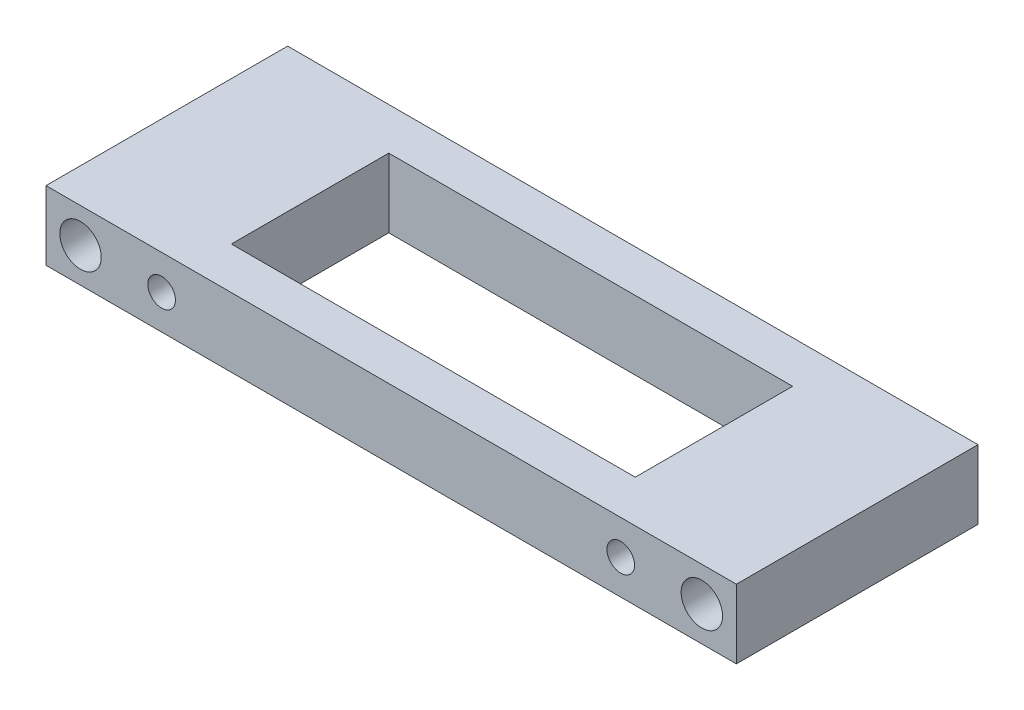
ISO-10303-21;
HEADER;
FILE_DESCRIPTION(('STEP AP214'),'2;1');
FILE_NAME('part.step','',(''),(''),'','','');
FILE_SCHEMA(('AUTOMOTIVE_DESIGN { 1 0 10303 214 1 1 1 1 }'));
ENDSEC;
DATA;
#1=APPLICATION_CONTEXT('core data for automotive mechanical design processes');
#2=APPLICATION_PROTOCOL_DEFINITION('international standard','automotive_design',2000,#1);
#3=PRODUCT_CONTEXT('',#1,'mechanical');
#4=PRODUCT('Part','Part','',(#3));
#5=PRODUCT_RELATED_PRODUCT_CATEGORY('part','',(#4));
#6=PRODUCT_DEFINITION_FORMATION('','',#4);
#7=PRODUCT_DEFINITION_CONTEXT('part definition',#1,'design');
#8=PRODUCT_DEFINITION('design','',#6,#7);
#9=PRODUCT_DEFINITION_SHAPE('','',#8);
#10=(LENGTH_UNIT() NAMED_UNIT(*) SI_UNIT(.MILLI.,.METRE.));
#11=(NAMED_UNIT(*) PLANE_ANGLE_UNIT() SI_UNIT($,.RADIAN.));
#12=(NAMED_UNIT(*) SI_UNIT($,.STERADIAN.) SOLID_ANGLE_UNIT());
#13=UNCERTAINTY_MEASURE_WITH_UNIT(LENGTH_MEASURE(1.E-05),#10,'distance_accuracy_value','');
#14=(GEOMETRIC_REPRESENTATION_CONTEXT(3) GLOBAL_UNCERTAINTY_ASSIGNED_CONTEXT((#13)) GLOBAL_UNIT_ASSIGNED_CONTEXT((#10,
#11,#12)) REPRESENTATION_CONTEXT('',''));
#15=CARTESIAN_POINT('',(0.,0.,0.));
#16=DIRECTION('',(0.,0.,1.));
#17=DIRECTION('',(1.,0.,0.));
#18=AXIS2_PLACEMENT_3D('',#15,#16,#17);
#19=CARTESIAN_POINT('',(0.,20.,40.));
#20=DIRECTION('',(0.,-1.,0.));
#21=DIRECTION('',(1.,0.,0.));
#22=AXIS2_PLACEMENT_3D('',#19,#20,#21);
#23=PLANE('',#22);
#24=DIRECTION('',(0.,0.,-1.));
#25=VECTOR('',#24,1.);
#26=CARTESIAN_POINT('',(100.,20.,40.));
#27=LINE('',#26,#25);
#28=CARTESIAN_POINT('',(100.,20.,40.));
#29=VERTEX_POINT('',#28);
#30=CARTESIAN_POINT('',(100.,20.,-30.));
#31=VERTEX_POINT('',#30);
#32=EDGE_CURVE('E145',#29,#31,#27,.T.);
#33=ORIENTED_EDGE('',*,*,#32,.T.);
#34=DIRECTION('',(1.,0.,0.));
#35=VECTOR('',#34,1.);
#36=CARTESIAN_POINT('',(-100.,20.,-30.));
#37=LINE('',#36,#35);
#38=CARTESIAN_POINT('',(-100.,20.,-30.));
#39=VERTEX_POINT('',#38);
#40=EDGE_CURVE('E164',#39,#31,#37,.T.);
#41=ORIENTED_EDGE('',*,*,#40,.F.);
#42=DIRECTION('',(0.,0.,-1.));
#43=VECTOR('',#42,1.);
#44=CARTESIAN_POINT('',(-100.,20.,40.));
#45=LINE('',#44,#43);
#46=CARTESIAN_POINT('',(-100.,20.,40.));
#47=VERTEX_POINT('',#46);
#48=EDGE_CURVE('E11',#47,#39,#45,.T.);
#49=ORIENTED_EDGE('',*,*,#48,.F.);
#50=DIRECTION('',(-1.,0.,0.));
#51=VECTOR('',#50,1.);
#52=CARTESIAN_POINT('',(0.,20.,40.));
#53=LINE('',#52,#51);
#54=EDGE_CURVE('E179',#29,#47,#53,.T.);
#55=ORIENTED_EDGE('',*,*,#54,.F.);
#56=EDGE_LOOP('',(#33,#41,#49,#55));
#57=FACE_BOUND('',#56,.T.);
#58=DIRECTION('',(-1.,0.,0.));
#59=VECTOR('',#58,1.);
#60=CARTESIAN_POINT('',(0.,20.,-17.8));
#61=LINE('',#60,#59);
#62=CARTESIAN_POINT('',(58.5,20.,-17.8));
#63=VERTEX_POINT('',#62);
#64=CARTESIAN_POINT('',(-58.5,20.,-17.8));
#65=VERTEX_POINT('',#64);
#66=EDGE_CURVE('E153',#63,#65,#61,.T.);
#67=ORIENTED_EDGE('',*,*,#66,.F.);
#68=DIRECTION('',(0.,0.,1.));
#69=VECTOR('',#68,1.);
#70=CARTESIAN_POINT('',(58.5,20.,-17.8));
#71=LINE('',#70,#69);
#72=CARTESIAN_POINT('',(58.5,20.,27.8));
#73=VERTEX_POINT('',#72);
#74=EDGE_CURVE('E117',#63,#73,#71,.T.);
#75=ORIENTED_EDGE('',*,*,#74,.T.);
#76=DIRECTION('',(1.,0.,0.));
#77=VECTOR('',#76,1.);
#78=CARTESIAN_POINT('',(0.,20.,27.8));
#79=LINE('',#78,#77);
#80=CARTESIAN_POINT('',(-58.5,20.,27.8));
#81=VERTEX_POINT('',#80);
#82=EDGE_CURVE('E158',#81,#73,#79,.T.);
#83=ORIENTED_EDGE('',*,*,#82,.F.);
#84=DIRECTION('',(0.,0.,1.));
#85=VECTOR('',#84,1.);
#86=CARTESIAN_POINT('',(-58.5,20.,-17.8));
#87=LINE('',#86,#85);
#88=EDGE_CURVE('E155',#65,#81,#87,.T.);
#89=ORIENTED_EDGE('',*,*,#88,.F.);
#90=EDGE_LOOP('',(#67,#75,#83,#89));
#91=FACE_BOUND('',#90,.T.);
#92=ADVANCED_FACE('F35',(#57,#91),#23,.F.);
#93=CARTESIAN_POINT('',(0.,0.,40.));
#94=DIRECTION('',(0.,1.,0.));
#95=DIRECTION('',(0.,0.,1.));
#96=AXIS2_PLACEMENT_3D('',#93,#94,#95);
#97=PLANE('',#96);
#98=DIRECTION('',(-1.,0.,0.));
#99=VECTOR('',#98,1.);
#100=CARTESIAN_POINT('',(-100.,0.,-30.));
#101=LINE('',#100,#99);
#102=CARTESIAN_POINT('',(100.,0.,-30.));
#103=VERTEX_POINT('',#102);
#104=CARTESIAN_POINT('',(-100.,0.,-30.));
#105=VERTEX_POINT('',#104);
#106=EDGE_CURVE('E166',#103,#105,#101,.T.);
#107=ORIENTED_EDGE('',*,*,#106,.F.);
#108=DIRECTION('',(0.,0.,-1.));
#109=VECTOR('',#108,1.);
#110=CARTESIAN_POINT('',(100.,0.,40.));
#111=LINE('',#110,#109);
#112=CARTESIAN_POINT('',(100.,0.,40.));
#113=VERTEX_POINT('',#112);
#114=EDGE_CURVE('E148',#113,#103,#111,.T.);
#115=ORIENTED_EDGE('',*,*,#114,.F.);
#116=DIRECTION('',(1.,0.,0.));
#117=VECTOR('',#116,1.);
#118=CARTESIAN_POINT('',(0.,0.,40.));
#119=LINE('',#118,#117);
#120=CARTESIAN_POINT('',(-100.,0.,40.));
#121=VERTEX_POINT('',#120);
#122=EDGE_CURVE('E184',#121,#113,#119,.T.);
#123=ORIENTED_EDGE('',*,*,#122,.F.);
#124=DIRECTION('',(0.,0.,-1.));
#125=VECTOR('',#124,1.);
#126=CARTESIAN_POINT('',(-100.,0.,40.));
#127=LINE('',#126,#125);
#128=EDGE_CURVE('E42',#121,#105,#127,.T.);
#129=ORIENTED_EDGE('',*,*,#128,.T.);
#130=EDGE_LOOP('',(#107,#115,#123,#129));
#131=FACE_BOUND('',#130,.T.);
#132=DIRECTION('',(0.,0.,-1.));
#133=VECTOR('',#132,1.);
#134=CARTESIAN_POINT('',(58.5,0.,-17.8));
#135=LINE('',#134,#133);
#136=CARTESIAN_POINT('',(58.5,0.,27.8));
#137=VERTEX_POINT('',#136);
#138=CARTESIAN_POINT('',(58.5,0.,-17.8));
#139=VERTEX_POINT('',#138);
#140=EDGE_CURVE('E114',#137,#139,#135,.T.);
#141=ORIENTED_EDGE('',*,*,#140,.T.);
#142=DIRECTION('',(1.,0.,0.));
#143=VECTOR('',#142,1.);
#144=CARTESIAN_POINT('',(0.,0.,-17.8));
#145=LINE('',#144,#143);
#146=CARTESIAN_POINT('',(-58.5,0.,-17.8));
#147=VERTEX_POINT('',#146);
#148=EDGE_CURVE('E98',#147,#139,#145,.T.);
#149=ORIENTED_EDGE('',*,*,#148,.F.);
#150=DIRECTION('',(0.,0.,-1.));
#151=VECTOR('',#150,1.);
#152=CARTESIAN_POINT('',(-58.5,0.,-17.8));
#153=LINE('',#152,#151);
#154=CARTESIAN_POINT('',(-58.5,0.,27.8));
#155=VERTEX_POINT('',#154);
#156=EDGE_CURVE('E49',#155,#147,#153,.T.);
#157=ORIENTED_EDGE('',*,*,#156,.F.);
#158=DIRECTION('',(-1.,0.,0.));
#159=VECTOR('',#158,1.);
#160=CARTESIAN_POINT('',(0.,0.,27.8));
#161=LINE('',#160,#159);
#162=EDGE_CURVE('E123',#137,#155,#161,.T.);
#163=ORIENTED_EDGE('',*,*,#162,.F.);
#164=EDGE_LOOP('',(#141,#149,#157,#163));
#165=FACE_BOUND('',#164,.T.);
#166=ADVANCED_FACE('F121',(#131,#165),#97,.F.);
#167=CARTESIAN_POINT('',(0.,0.,40.));
#168=DIRECTION('',(0.,0.,1.));
#169=DIRECTION('',(1.,0.,0.));
#170=AXIS2_PLACEMENT_3D('',#167,#168,#169);
#171=PLANE('',#170);
#172=CARTESIAN_POINT('',(-90.,9.99999999999999,40.));
#173=DIRECTION('',(0.,0.,1.));
#174=DIRECTION('',(1.,0.,0.));
#175=AXIS2_PLACEMENT_3D('',#172,#173,#174);
#176=CIRCLE('',#175,6.);
#177=CARTESIAN_POINT('',(-84.,9.99999999999999,40.));
#178=VERTEX_POINT('',#177);
#179=EDGE_CURVE('E176',#178,#178,#176,.T.);
#180=ORIENTED_EDGE('',*,*,#179,.F.);
#181=EDGE_LOOP('',(#180));
#182=FACE_BOUND('',#181,.T.);
#183=ORIENTED_EDGE('',*,*,#122,.T.);
#184=DIRECTION('',(0.,-1.,0.));
#185=VECTOR('',#184,1.);
#186=CARTESIAN_POINT('',(100.,0.,40.));
#187=LINE('',#186,#185);
#188=EDGE_CURVE('E142',#29,#113,#187,.T.);
#189=ORIENTED_EDGE('',*,*,#188,.F.);
#190=ORIENTED_EDGE('',*,*,#54,.T.);
#191=DIRECTION('',(0.,-1.,0.));
#192=VECTOR('',#191,1.);
#193=CARTESIAN_POINT('',(-100.,0.,40.));
#194=LINE('',#193,#192);
#195=EDGE_CURVE('E57',#47,#121,#194,.T.);
#196=ORIENTED_EDGE('',*,*,#195,.T.);
#197=EDGE_LOOP('',(#183,#189,#190,#196));
#198=FACE_BOUND('',#197,.T.);
#199=CARTESIAN_POINT('',(-66.5,9.99999999999999,40.));
#200=DIRECTION('',(0.,0.,1.));
#201=DIRECTION('',(1.,0.,0.));
#202=AXIS2_PLACEMENT_3D('',#199,#200,#201);
#203=CIRCLE('',#202,4.00000000000001);
#204=CARTESIAN_POINT('',(-62.5,9.99999999999999,40.));
#205=VERTEX_POINT('',#204);
#206=EDGE_CURVE('E170',#205,#205,#203,.T.);
#207=ORIENTED_EDGE('',*,*,#206,.F.);
#208=EDGE_LOOP('',(#207));
#209=FACE_BOUND('',#208,.T.);
#210=CARTESIAN_POINT('',(66.5,9.99999999999999,40.));
#211=DIRECTION('',(0.,0.,-1.));
#212=DIRECTION('',(-1.,0.,0.));
#213=AXIS2_PLACEMENT_3D('',#210,#211,#212);
#214=CIRCLE('',#213,4.00000000000001);
#215=CARTESIAN_POINT('',(62.5,9.99999999999999,40.));
#216=VERTEX_POINT('',#215);
#217=EDGE_CURVE('E136',#216,#216,#214,.T.);
#218=ORIENTED_EDGE('',*,*,#217,.T.);
#219=EDGE_LOOP('',(#218));
#220=FACE_BOUND('',#219,.T.);
#221=CARTESIAN_POINT('',(90.,9.99999999999999,40.));
#222=DIRECTION('',(0.,0.,-1.));
#223=DIRECTION('',(-1.,0.,0.));
#224=AXIS2_PLACEMENT_3D('',#221,#222,#223);
#225=CIRCLE('',#224,6.);
#226=CARTESIAN_POINT('',(84.,9.99999999999999,40.));
#227=VERTEX_POINT('',#226);
#228=EDGE_CURVE('E139',#227,#227,#225,.T.);
#229=ORIENTED_EDGE('',*,*,#228,.T.);
#230=EDGE_LOOP('',(#229));
#231=FACE_BOUND('',#230,.T.);
#232=ADVANCED_FACE('F202',(#182,#198,#209,#220,#231),#171,.T.);
#233=CARTESIAN_POINT('',(-100.,0.,40.));
#234=DIRECTION('',(1.,0.,0.));
#235=DIRECTION('',(0.,0.,-1.));
#236=AXIS2_PLACEMENT_3D('',#233,#234,#235);
#237=PLANE('',#236);
#238=ORIENTED_EDGE('',*,*,#48,.T.);
#239=DIRECTION('',(0.,1.,0.));
#240=VECTOR('',#239,1.);
#241=CARTESIAN_POINT('',(-100.,20.,-30.));
#242=LINE('',#241,#240);
#243=EDGE_CURVE('E107',#105,#39,#242,.T.);
#244=ORIENTED_EDGE('',*,*,#243,.F.);
#245=ORIENTED_EDGE('',*,*,#128,.F.);
#246=ORIENTED_EDGE('',*,*,#195,.F.);
#247=EDGE_LOOP('',(#238,#244,#245,#246));
#248=FACE_BOUND('',#247,.T.);
#249=ADVANCED_FACE('F193',(#248),#237,.F.);
#250=CARTESIAN_POINT('',(-90.,9.99999999999999,40.));
#251=DIRECTION('',(0.,0.,-1.));
#252=DIRECTION('',(-1.,0.,0.));
#253=AXIS2_PLACEMENT_3D('',#250,#251,#252);
#254=CYLINDRICAL_SURFACE('',#253,6.);
#255=ORIENTED_EDGE('',*,*,#179,.T.);
#256=EDGE_LOOP('',(#255));
#257=FACE_BOUND('',#256,.T.);
#258=CARTESIAN_POINT('',(-90.,9.99999999999999,0.));
#259=DIRECTION('',(0.,0.,1.));
#260=DIRECTION('',(1.,0.,0.));
#261=AXIS2_PLACEMENT_3D('',#258,#259,#260);
#262=CIRCLE('',#261,6.);
#263=CARTESIAN_POINT('',(-84.,9.99999999999999,0.));
#264=VERTEX_POINT('',#263);
#265=EDGE_CURVE('E173',#264,#264,#262,.T.);
#266=ORIENTED_EDGE('',*,*,#265,.F.);
#267=EDGE_LOOP('',(#266));
#268=FACE_BOUND('',#267,.T.);
#269=ADVANCED_FACE('F240',(#257,#268),#254,.F.);
#270=CARTESIAN_POINT('',(-66.5,9.99999999999999,40.));
#271=DIRECTION('',(0.,0.,-1.));
#272=DIRECTION('',(-1.,0.,0.));
#273=AXIS2_PLACEMENT_3D('',#270,#271,#272);
#274=CYLINDRICAL_SURFACE('',#273,4.00000000000001);
#275=ORIENTED_EDGE('',*,*,#206,.T.);
#276=EDGE_LOOP('',(#275));
#277=FACE_BOUND('',#276,.T.);
#278=CARTESIAN_POINT('',(-66.5,9.99999999999999,0.));
#279=DIRECTION('',(0.,0.,1.));
#280=DIRECTION('',(1.,0.,0.));
#281=AXIS2_PLACEMENT_3D('',#278,#279,#280);
#282=CIRCLE('',#281,4.00000000000001);
#283=CARTESIAN_POINT('',(-62.5,9.99999999999999,0.));
#284=VERTEX_POINT('',#283);
#285=EDGE_CURVE('E169',#284,#284,#282,.T.);
#286=ORIENTED_EDGE('',*,*,#285,.F.);
#287=EDGE_LOOP('',(#286));
#288=FACE_BOUND('',#287,.T.);
#289=ADVANCED_FACE('F244',(#277,#288),#274,.F.);
#290=CARTESIAN_POINT('',(0.,0.,0.));
#291=DIRECTION('',(0.,0.,1.));
#292=DIRECTION('',(1.,0.,0.));
#293=AXIS2_PLACEMENT_3D('',#290,#291,#292);
#294=PLANE('',#293);
#295=ORIENTED_EDGE('',*,*,#285,.T.);
#296=EDGE_LOOP('',(#295));
#297=FACE_BOUND('',#296,.T.);
#298=ADVANCED_FACE('F249',(#297),#294,.T.);
#299=ORIENTED_EDGE('',*,*,#265,.T.);
#300=EDGE_LOOP('',(#299));
#301=FACE_BOUND('',#300,.T.);
#302=ADVANCED_FACE('F254',(#301),#294,.T.);
#303=CARTESIAN_POINT('',(0.,0.,-30.));
#304=DIRECTION('',(0.,0.,1.));
#305=DIRECTION('',(1.,0.,0.));
#306=AXIS2_PLACEMENT_3D('',#303,#304,#305);
#307=PLANE('',#306);
#308=ORIENTED_EDGE('',*,*,#243,.T.);
#309=ORIENTED_EDGE('',*,*,#40,.T.);
#310=DIRECTION('',(0.,1.,0.));
#311=VECTOR('',#310,1.);
#312=CARTESIAN_POINT('',(100.,20.,-30.));
#313=LINE('',#312,#311);
#314=EDGE_CURVE('E118',#103,#31,#313,.T.);
#315=ORIENTED_EDGE('',*,*,#314,.F.);
#316=ORIENTED_EDGE('',*,*,#106,.T.);
#317=EDGE_LOOP('',(#308,#309,#315,#316));
#318=FACE_BOUND('',#317,.T.);
#319=ADVANCED_FACE('F192',(#318),#307,.F.);
#320=CARTESIAN_POINT('',(0.,-0.001000000000001,27.8));
#321=DIRECTION('',(0.,0.,1.));
#322=DIRECTION('',(1.,0.,0.));
#323=AXIS2_PLACEMENT_3D('',#320,#321,#322);
#324=PLANE('',#323);
#325=ORIENTED_EDGE('',*,*,#162,.T.);
#326=DIRECTION('',(0.,1.,0.));
#327=VECTOR('',#326,1.);
#328=CARTESIAN_POINT('',(-58.5,-0.00100000000000794,27.8));
#329=LINE('',#328,#327);
#330=EDGE_CURVE('E108',#155,#81,#329,.T.);
#331=ORIENTED_EDGE('',*,*,#330,.T.);
#332=ORIENTED_EDGE('',*,*,#82,.T.);
#333=DIRECTION('',(0.,1.,0.));
#334=VECTOR('',#333,1.);
#335=CARTESIAN_POINT('',(58.5,-0.00100000000001835,27.8));
#336=LINE('',#335,#334);
#337=EDGE_CURVE('E119',#137,#73,#336,.T.);
#338=ORIENTED_EDGE('',*,*,#337,.F.);
#339=EDGE_LOOP('',(#325,#331,#332,#338));
#340=FACE_BOUND('',#339,.T.);
#341=ADVANCED_FACE('F260',(#340),#324,.F.);
#342=CARTESIAN_POINT('',(-58.5,-0.00100000000000794,-17.8));
#343=DIRECTION('',(-1.,0.,0.));
#344=DIRECTION('',(0.,0.,1.));
#345=AXIS2_PLACEMENT_3D('',#342,#343,#344);
#346=PLANE('',#345);
#347=ORIENTED_EDGE('',*,*,#156,.T.);
#348=DIRECTION('',(0.,1.,0.));
#349=VECTOR('',#348,1.);
#350=CARTESIAN_POINT('',(-58.5,-0.00100000000000794,-17.8));
#351=LINE('',#350,#349);
#352=EDGE_CURVE('E104',#147,#65,#351,.T.);
#353=ORIENTED_EDGE('',*,*,#352,.T.);
#354=ORIENTED_EDGE('',*,*,#88,.T.);
#355=ORIENTED_EDGE('',*,*,#330,.F.);
#356=EDGE_LOOP('',(#347,#353,#354,#355));
#357=FACE_BOUND('',#356,.T.);
#358=ADVANCED_FACE('F263',(#357),#346,.F.);
#359=CARTESIAN_POINT('',(0.,-0.001000000000001,-17.8));
#360=DIRECTION('',(0.,0.,-1.));
#361=DIRECTION('',(-1.,0.,0.));
#362=AXIS2_PLACEMENT_3D('',#359,#360,#361);
#363=PLANE('',#362);
#364=ORIENTED_EDGE('',*,*,#148,.T.);
#365=DIRECTION('',(0.,1.,0.));
#366=VECTOR('',#365,1.);
#367=CARTESIAN_POINT('',(58.5,-0.00100000000001835,-17.8));
#368=LINE('',#367,#366);
#369=EDGE_CURVE('E102',#139,#63,#368,.T.);
#370=ORIENTED_EDGE('',*,*,#369,.T.);
#371=ORIENTED_EDGE('',*,*,#66,.T.);
#372=ORIENTED_EDGE('',*,*,#352,.F.);
#373=EDGE_LOOP('',(#364,#370,#371,#372));
#374=FACE_BOUND('',#373,.T.);
#375=ADVANCED_FACE('F100',(#374),#363,.F.);
#376=CARTESIAN_POINT('',(100.,0.,40.));
#377=DIRECTION('',(1.,0.,0.));
#378=DIRECTION('',(0.,1.,0.));
#379=AXIS2_PLACEMENT_3D('',#376,#377,#378);
#380=PLANE('',#379);
#381=ORIENTED_EDGE('',*,*,#114,.T.);
#382=ORIENTED_EDGE('',*,*,#314,.T.);
#383=ORIENTED_EDGE('',*,*,#32,.F.);
#384=ORIENTED_EDGE('',*,*,#188,.T.);
#385=EDGE_LOOP('',(#381,#382,#383,#384));
#386=FACE_BOUND('',#385,.T.);
#387=ADVANCED_FACE('F201',(#386),#380,.T.);
#388=CARTESIAN_POINT('',(90.,9.99999999999999,40.));
#389=DIRECTION('',(0.,0.,-1.));
#390=DIRECTION('',(-1.,0.,0.));
#391=AXIS2_PLACEMENT_3D('',#388,#389,#390);
#392=CYLINDRICAL_SURFACE('',#391,6.);
#393=ORIENTED_EDGE('',*,*,#228,.F.);
#394=EDGE_LOOP('',(#393));
#395=FACE_BOUND('',#394,.T.);
#396=CARTESIAN_POINT('',(90.,9.99999999999999,0.));
#397=DIRECTION('',(0.,0.,1.));
#398=DIRECTION('',(1.,0.,0.));
#399=AXIS2_PLACEMENT_3D('',#396,#397,#398);
#400=CIRCLE('',#399,6.);
#401=CARTESIAN_POINT('',(96.,9.99999999999999,0.));
#402=VERTEX_POINT('',#401);
#403=EDGE_CURVE('E133',#402,#402,#400,.F.);
#404=ORIENTED_EDGE('',*,*,#403,.T.);
#405=EDGE_LOOP('',(#404));
#406=FACE_BOUND('',#405,.T.);
#407=ADVANCED_FACE('F213',(#395,#406),#392,.F.);
#408=CARTESIAN_POINT('',(66.5,9.99999999999999,40.));
#409=DIRECTION('',(0.,0.,-1.));
#410=DIRECTION('',(-1.,0.,0.));
#411=AXIS2_PLACEMENT_3D('',#408,#409,#410);
#412=CYLINDRICAL_SURFACE('',#411,4.00000000000001);
#413=ORIENTED_EDGE('',*,*,#217,.F.);
#414=EDGE_LOOP('',(#413));
#415=FACE_BOUND('',#414,.T.);
#416=CARTESIAN_POINT('',(66.5,9.99999999999999,0.));
#417=DIRECTION('',(0.,0.,1.));
#418=DIRECTION('',(1.,0.,0.));
#419=AXIS2_PLACEMENT_3D('',#416,#417,#418);
#420=CIRCLE('',#419,4.00000000000001);
#421=CARTESIAN_POINT('',(70.5,9.99999999999999,0.));
#422=VERTEX_POINT('',#421);
#423=EDGE_CURVE('E130',#422,#422,#420,.F.);
#424=ORIENTED_EDGE('',*,*,#423,.T.);
#425=EDGE_LOOP('',(#424));
#426=FACE_BOUND('',#425,.T.);
#427=ADVANCED_FACE('F216',(#415,#426),#412,.F.);
#428=CARTESIAN_POINT('',(0.,0.,0.));
#429=DIRECTION('',(0.,0.,1.));
#430=DIRECTION('',(-1.,0.,0.));
#431=AXIS2_PLACEMENT_3D('',#428,#429,#430);
#432=PLANE('',#431);
#433=ORIENTED_EDGE('',*,*,#423,.F.);
#434=EDGE_LOOP('',(#433));
#435=FACE_BOUND('',#434,.T.);
#436=ADVANCED_FACE('F222',(#435),#432,.T.);
#437=ORIENTED_EDGE('',*,*,#403,.F.);
#438=EDGE_LOOP('',(#437));
#439=FACE_BOUND('',#438,.T.);
#440=ADVANCED_FACE('F220',(#439),#432,.T.);
#441=CARTESIAN_POINT('',(58.5,-0.00100000000001835,-17.8));
#442=DIRECTION('',(-1.,0.,0.));
#443=DIRECTION('',(0.,0.,1.));
#444=AXIS2_PLACEMENT_3D('',#441,#442,#443);
#445=PLANE('',#444);
#446=ORIENTED_EDGE('',*,*,#337,.T.);
#447=ORIENTED_EDGE('',*,*,#74,.F.);
#448=ORIENTED_EDGE('',*,*,#369,.F.);
#449=ORIENTED_EDGE('',*,*,#140,.F.);
#450=EDGE_LOOP('',(#446,#447,#448,#449));
#451=FACE_BOUND('',#450,.T.);
#452=ADVANCED_FACE('F113',(#451),#445,.T.);
#453=CLOSED_SHELL('',(#92,#166,#232,#249,#269,#289,#298,#302,#319,#341,#358,#375,#387,#407,#427,
#436,#440,#452));
#454=MANIFOLD_SOLID_BREP('B2',#453);
#455=ADVANCED_BREP_SHAPE_REPRESENTATION('',(#18,#454),#14);
#456=SHAPE_DEFINITION_REPRESENTATION(#9,#455);
ENDSEC;
END-ISO-10303-21;
